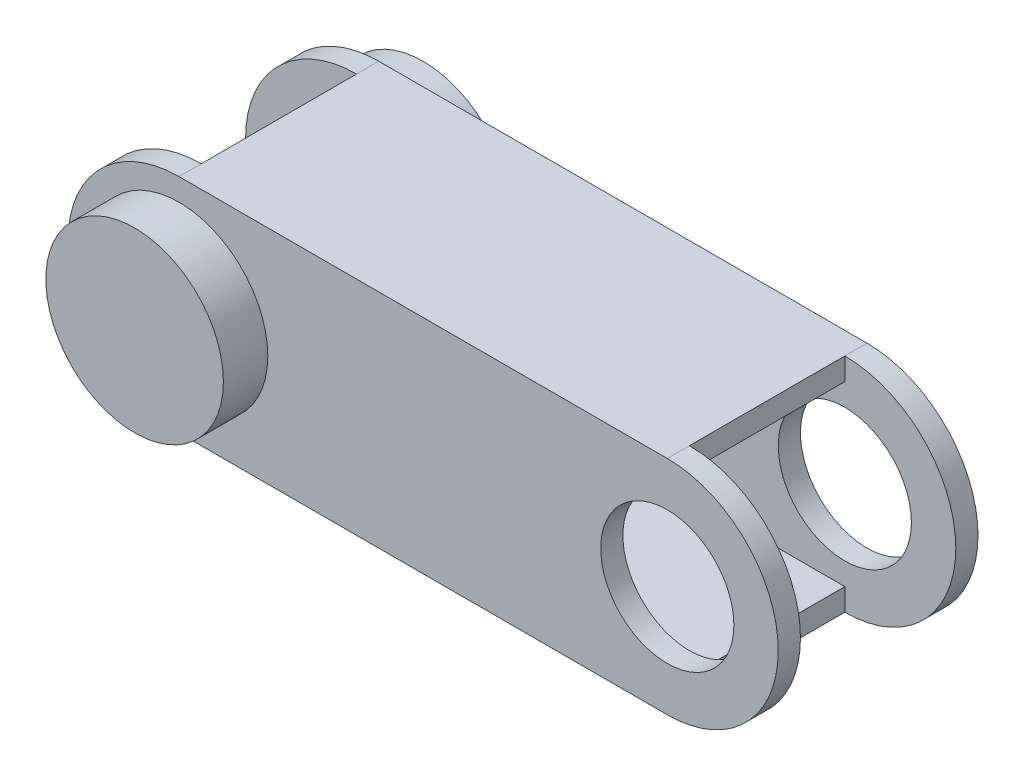
ISO-10303-21;
HEADER;
FILE_DESCRIPTION(('STEP AP214'),'2;1');
FILE_NAME('part.step','',(''),(''),'','','');
FILE_SCHEMA(('AUTOMOTIVE_DESIGN { 1 0 10303 214 1 1 1 1 }'));
ENDSEC;
DATA;
#1=APPLICATION_CONTEXT('core data for automotive mechanical design processes');
#2=APPLICATION_PROTOCOL_DEFINITION('international standard','automotive_design',2000,#1);
#3=PRODUCT_CONTEXT('',#1,'mechanical');
#4=PRODUCT('Part','Part','',(#3));
#5=PRODUCT_RELATED_PRODUCT_CATEGORY('part','',(#4));
#6=PRODUCT_DEFINITION_FORMATION('','',#4);
#7=PRODUCT_DEFINITION_CONTEXT('part definition',#1,'design');
#8=PRODUCT_DEFINITION('design','',#6,#7);
#9=PRODUCT_DEFINITION_SHAPE('','',#8);
#10=(LENGTH_UNIT() NAMED_UNIT(*) SI_UNIT(.MILLI.,.METRE.));
#11=(NAMED_UNIT(*) PLANE_ANGLE_UNIT() SI_UNIT($,.RADIAN.));
#12=(NAMED_UNIT(*) SI_UNIT($,.STERADIAN.) SOLID_ANGLE_UNIT());
#13=UNCERTAINTY_MEASURE_WITH_UNIT(LENGTH_MEASURE(1.E-05),#10,'distance_accuracy_value','');
#14=(GEOMETRIC_REPRESENTATION_CONTEXT(3) GLOBAL_UNCERTAINTY_ASSIGNED_CONTEXT((#13)) GLOBAL_UNIT_ASSIGNED_CONTEXT((#10,
#11,#12)) REPRESENTATION_CONTEXT('',''));
#15=CARTESIAN_POINT('',(0.,0.,0.));
#16=DIRECTION('',(0.,0.,1.));
#17=DIRECTION('',(1.,0.,0.));
#18=AXIS2_PLACEMENT_3D('',#15,#16,#17);
#19=CARTESIAN_POINT('',(0.,0.,0.));
#20=DIRECTION('',(0.,0.,1.));
#21=DIRECTION('',(1.,0.,0.));
#22=AXIS2_PLACEMENT_3D('',#19,#20,#21);
#23=PLANE('',#22);
#24=CARTESIAN_POINT('',(0.,0.,0.));
#25=DIRECTION('',(0.,0.,1.));
#26=DIRECTION('',(1.,0.,0.));
#27=AXIS2_PLACEMENT_3D('',#24,#25,#26);
#28=CIRCLE('',#27,30.);
#29=CARTESIAN_POINT('',(30.,0.,0.));
#30=VERTEX_POINT('',#29);
#31=EDGE_CURVE('E219',#30,#30,#28,.T.);
#32=ORIENTED_EDGE('',*,*,#31,.T.);
#33=EDGE_LOOP('',(#32));
#34=FACE_BOUND('',#33,.T.);
#35=DIRECTION('',(0.,1.,0.));
#36=VECTOR('',#35,1.);
#37=CARTESIAN_POINT('',(0.,40.,0.));
#38=LINE('',#37,#36);
#39=CARTESIAN_POINT('',(0.,40.,0.));
#40=VERTEX_POINT('',#39);
#41=CARTESIAN_POINT('',(0.,50.,0.));
#42=VERTEX_POINT('',#41);
#43=EDGE_CURVE('E150',#40,#42,#38,.T.);
#44=ORIENTED_EDGE('',*,*,#43,.T.);
#45=CARTESIAN_POINT('',(0.,0.,0.));
#46=DIRECTION('',(0.,0.,1.));
#47=DIRECTION('',(1.,0.,0.));
#48=AXIS2_PLACEMENT_3D('',#45,#46,#47);
#49=CIRCLE('',#48,50.);
#50=CARTESIAN_POINT('',(0.,-50.,0.));
#51=VERTEX_POINT('',#50);
#52=EDGE_CURVE('E225',#51,#42,#49,.T.);
#53=ORIENTED_EDGE('',*,*,#52,.F.);
#54=DIRECTION('',(0.,-1.,0.));
#55=VECTOR('',#54,1.);
#56=CARTESIAN_POINT('',(0.,-40.,0.));
#57=LINE('',#56,#55);
#58=CARTESIAN_POINT('',(0.,-40.,0.));
#59=VERTEX_POINT('',#58);
#60=EDGE_CURVE('E207',#59,#51,#57,.T.);
#61=ORIENTED_EDGE('',*,*,#60,.F.);
#62=DIRECTION('',(-1.,0.,0.));
#63=VECTOR('',#62,1.);
#64=CARTESIAN_POINT('',(0.,-40.,0.));
#65=LINE('',#64,#63);
#66=CARTESIAN_POINT('',(-220.,-40.,0.));
#67=VERTEX_POINT('',#66);
#68=EDGE_CURVE('E200',#59,#67,#65,.T.);
#69=ORIENTED_EDGE('',*,*,#68,.T.);
#70=DIRECTION('',(0.,-1.,0.));
#71=VECTOR('',#70,1.);
#72=CARTESIAN_POINT('',(-220.,-40.,0.));
#73=LINE('',#72,#71);
#74=CARTESIAN_POINT('',(-220.,-50.,0.));
#75=VERTEX_POINT('',#74);
#76=EDGE_CURVE('E217',#67,#75,#73,.T.);
#77=ORIENTED_EDGE('',*,*,#76,.T.);
#78=CARTESIAN_POINT('',(-220.,0.,0.));
#79=DIRECTION('',(0.,0.,1.));
#80=DIRECTION('',(1.,0.,0.));
#81=AXIS2_PLACEMENT_3D('',#78,#79,#80);
#82=CIRCLE('',#81,50.);
#83=CARTESIAN_POINT('',(-220.,50.,0.));
#84=VERTEX_POINT('',#83);
#85=EDGE_CURVE('E149',#84,#75,#82,.T.);
#86=ORIENTED_EDGE('',*,*,#85,.F.);
#87=DIRECTION('',(0.,1.,0.));
#88=VECTOR('',#87,1.);
#89=CARTESIAN_POINT('',(-220.,40.,0.));
#90=LINE('',#89,#88);
#91=CARTESIAN_POINT('',(-220.,40.,0.));
#92=VERTEX_POINT('',#91);
#93=EDGE_CURVE('E138',#92,#84,#90,.T.);
#94=ORIENTED_EDGE('',*,*,#93,.F.);
#95=DIRECTION('',(-1.,0.,0.));
#96=VECTOR('',#95,1.);
#97=CARTESIAN_POINT('',(0.,40.,0.));
#98=LINE('',#97,#96);
#99=EDGE_CURVE('E128',#40,#92,#98,.T.);
#100=ORIENTED_EDGE('',*,*,#99,.F.);
#101=EDGE_LOOP('',(#44,#53,#61,#69,#77,#86,#94,#100));
#102=FACE_BOUND('',#101,.T.);
#103=ADVANCED_FACE('F41',(#34,#102),#23,.F.);
#104=CARTESIAN_POINT('',(0.,0.,-70.));
#105=DIRECTION('',(0.,0.,-1.));
#106=DIRECTION('',(1.,0.,0.));
#107=AXIS2_PLACEMENT_3D('',#104,#105,#106);
#108=PLANE('',#107);
#109=CARTESIAN_POINT('',(0.,0.,-70.));
#110=DIRECTION('',(0.,0.,1.));
#111=DIRECTION('',(1.,0.,0.));
#112=AXIS2_PLACEMENT_3D('',#109,#110,#111);
#113=CIRCLE('',#112,30.);
#114=CARTESIAN_POINT('',(30.,0.,-70.));
#115=VERTEX_POINT('',#114);
#116=EDGE_CURVE('E158',#115,#115,#113,.T.);
#117=ORIENTED_EDGE('',*,*,#116,.F.);
#118=EDGE_LOOP('',(#117));
#119=FACE_BOUND('',#118,.T.);
#120=DIRECTION('',(0.,1.,0.));
#121=VECTOR('',#120,1.);
#122=CARTESIAN_POINT('',(0.,0.,-70.));
#123=LINE('',#122,#121);
#124=CARTESIAN_POINT('',(0.,40.,-70.));
#125=VERTEX_POINT('',#124);
#126=CARTESIAN_POINT('',(0.,50.,-70.));
#127=VERTEX_POINT('',#126);
#128=EDGE_CURVE('E11',#125,#127,#123,.T.);
#129=ORIENTED_EDGE('',*,*,#128,.F.);
#130=DIRECTION('',(-1.,0.,0.));
#131=VECTOR('',#130,1.);
#132=CARTESIAN_POINT('',(0.,40.,-70.));
#133=LINE('',#132,#131);
#134=CARTESIAN_POINT('',(-220.,40.,-70.));
#135=VERTEX_POINT('',#134);
#136=EDGE_CURVE('E56',#125,#135,#133,.T.);
#137=ORIENTED_EDGE('',*,*,#136,.T.);
#138=DIRECTION('',(0.,-1.,0.));
#139=VECTOR('',#138,1.);
#140=CARTESIAN_POINT('',(-220.,0.,-70.));
#141=LINE('',#140,#139);
#142=CARTESIAN_POINT('',(-220.,50.,-70.));
#143=VERTEX_POINT('',#142);
#144=EDGE_CURVE('E49',#143,#135,#141,.T.);
#145=ORIENTED_EDGE('',*,*,#144,.F.);
#146=CARTESIAN_POINT('',(-220.,0.,-70.));
#147=DIRECTION('',(0.,0.,1.));
#148=DIRECTION('',(1.,0.,0.));
#149=AXIS2_PLACEMENT_3D('',#146,#147,#148);
#150=CIRCLE('',#149,50.);
#151=CARTESIAN_POINT('',(-220.,-50.,-70.));
#152=VERTEX_POINT('',#151);
#153=EDGE_CURVE('E173',#143,#152,#150,.T.);
#154=ORIENTED_EDGE('',*,*,#153,.T.);
#155=DIRECTION('',(0.,-1.,0.));
#156=VECTOR('',#155,1.);
#157=CARTESIAN_POINT('',(-220.,-40.,-70.));
#158=LINE('',#157,#156);
#159=CARTESIAN_POINT('',(-220.,-40.,-70.));
#160=VERTEX_POINT('',#159);
#161=EDGE_CURVE('E188',#160,#152,#158,.T.);
#162=ORIENTED_EDGE('',*,*,#161,.F.);
#163=DIRECTION('',(-1.,0.,0.));
#164=VECTOR('',#163,1.);
#165=CARTESIAN_POINT('',(0.,-40.,-70.));
#166=LINE('',#165,#164);
#167=CARTESIAN_POINT('',(0.,-40.,-70.));
#168=VERTEX_POINT('',#167);
#169=EDGE_CURVE('E162',#168,#160,#166,.T.);
#170=ORIENTED_EDGE('',*,*,#169,.F.);
#171=DIRECTION('',(0.,1.,0.));
#172=VECTOR('',#171,1.);
#173=CARTESIAN_POINT('',(0.,-40.,-70.));
#174=LINE('',#173,#172);
#175=CARTESIAN_POINT('',(0.,-50.,-70.));
#176=VERTEX_POINT('',#175);
#177=EDGE_CURVE('E191',#176,#168,#174,.T.);
#178=ORIENTED_EDGE('',*,*,#177,.F.);
#179=CARTESIAN_POINT('',(0.,0.,-70.));
#180=DIRECTION('',(0.,0.,1.));
#181=DIRECTION('',(1.,0.,0.));
#182=AXIS2_PLACEMENT_3D('',#179,#180,#181);
#183=CIRCLE('',#182,50.);
#184=EDGE_CURVE('E166',#176,#127,#183,.T.);
#185=ORIENTED_EDGE('',*,*,#184,.T.);
#186=EDGE_LOOP('',(#129,#137,#145,#154,#162,#170,#178,#185));
#187=FACE_BOUND('',#186,.T.);
#188=ADVANCED_FACE('F297',(#119,#187),#108,.F.);
#189=CARTESIAN_POINT('',(0.,-40.,0.));
#190=DIRECTION('',(1.,0.,0.));
#191=DIRECTION('',(0.,1.,0.));
#192=AXIS2_PLACEMENT_3D('',#189,#190,#191);
#193=PLANE('',#192);
#194=DIRECTION('',(0.,0.,1.));
#195=VECTOR('',#194,1.);
#196=CARTESIAN_POINT('',(0.,-50.,0.));
#197=LINE('',#196,#195);
#198=EDGE_CURVE('E212',#176,#51,#197,.T.);
#199=ORIENTED_EDGE('',*,*,#198,.F.);
#200=ORIENTED_EDGE('',*,*,#177,.T.);
#201=DIRECTION('',(0.,0.,1.));
#202=VECTOR('',#201,1.);
#203=CARTESIAN_POINT('',(0.,-40.,0.));
#204=LINE('',#203,#202);
#205=EDGE_CURVE('E198',#168,#59,#204,.T.);
#206=ORIENTED_EDGE('',*,*,#205,.T.);
#207=ORIENTED_EDGE('',*,*,#60,.T.);
#208=EDGE_LOOP('',(#199,#200,#206,#207));
#209=FACE_BOUND('',#208,.T.);
#210=ADVANCED_FACE('F303',(#209),#193,.T.);
#211=CARTESIAN_POINT('',(-220.,-40.,0.));
#212=DIRECTION('',(-1.,0.,0.));
#213=DIRECTION('',(0.,-1.,0.));
#214=AXIS2_PLACEMENT_3D('',#211,#212,#213);
#215=PLANE('',#214);
#216=DIRECTION('',(0.,0.,-1.));
#217=VECTOR('',#216,1.);
#218=CARTESIAN_POINT('',(-220.,-40.,0.));
#219=LINE('',#218,#217);
#220=EDGE_CURVE('E204',#67,#160,#219,.T.);
#221=ORIENTED_EDGE('',*,*,#220,.T.);
#222=ORIENTED_EDGE('',*,*,#161,.T.);
#223=DIRECTION('',(0.,0.,-1.));
#224=VECTOR('',#223,1.);
#225=CARTESIAN_POINT('',(-220.,-50.,0.));
#226=LINE('',#225,#224);
#227=EDGE_CURVE('E211',#75,#152,#226,.T.);
#228=ORIENTED_EDGE('',*,*,#227,.F.);
#229=ORIENTED_EDGE('',*,*,#76,.F.);
#230=EDGE_LOOP('',(#221,#222,#228,#229));
#231=FACE_BOUND('',#230,.T.);
#232=ADVANCED_FACE('F261',(#231),#215,.T.);
#233=CARTESIAN_POINT('',(0.,-40.,0.));
#234=DIRECTION('',(0.,1.,0.));
#235=DIRECTION('',(-1.,0.,0.));
#236=AXIS2_PLACEMENT_3D('',#233,#234,#235);
#237=PLANE('',#236);
#238=ORIENTED_EDGE('',*,*,#205,.F.);
#239=ORIENTED_EDGE('',*,*,#169,.T.);
#240=ORIENTED_EDGE('',*,*,#220,.F.);
#241=ORIENTED_EDGE('',*,*,#68,.F.);
#242=EDGE_LOOP('',(#238,#239,#240,#241));
#243=FACE_BOUND('',#242,.T.);
#244=ADVANCED_FACE('F258',(#243),#237,.T.);
#245=CARTESIAN_POINT('',(0.,0.,10.));
#246=DIRECTION('',(0.,0.,1.));
#247=DIRECTION('',(1.,0.,0.));
#248=AXIS2_PLACEMENT_3D('',#245,#246,#247);
#249=PLANE('',#248);
#250=DIRECTION('',(1.,0.,0.));
#251=VECTOR('',#250,1.);
#252=CARTESIAN_POINT('',(0.,-50.,10.));
#253=LINE('',#252,#251);
#254=CARTESIAN_POINT('',(-220.,-50.,10.));
#255=VERTEX_POINT('',#254);
#256=CARTESIAN_POINT('',(0.,-50.,10.));
#257=VERTEX_POINT('',#256);
#258=EDGE_CURVE('E235',#255,#257,#253,.T.);
#259=ORIENTED_EDGE('',*,*,#258,.T.);
#260=CARTESIAN_POINT('',(0.,0.,10.));
#261=DIRECTION('',(0.,0.,1.));
#262=DIRECTION('',(1.,0.,0.));
#263=AXIS2_PLACEMENT_3D('',#260,#261,#262);
#264=CIRCLE('',#263,50.);
#265=CARTESIAN_POINT('',(0.,50.,10.));
#266=VERTEX_POINT('',#265);
#267=EDGE_CURVE('E228',#257,#266,#264,.T.);
#268=ORIENTED_EDGE('',*,*,#267,.T.);
#269=DIRECTION('',(-1.,0.,0.));
#270=VECTOR('',#269,1.);
#271=CARTESIAN_POINT('',(0.,50.,10.));
#272=LINE('',#271,#270);
#273=CARTESIAN_POINT('',(-220.,50.,10.));
#274=VERTEX_POINT('',#273);
#275=EDGE_CURVE('E231',#266,#274,#272,.T.);
#276=ORIENTED_EDGE('',*,*,#275,.T.);
#277=CARTESIAN_POINT('',(-220.,0.,10.));
#278=DIRECTION('',(0.,0.,1.));
#279=DIRECTION('',(1.,0.,0.));
#280=AXIS2_PLACEMENT_3D('',#277,#278,#279);
#281=CIRCLE('',#280,50.);
#282=EDGE_CURVE('E233',#274,#255,#281,.T.);
#283=ORIENTED_EDGE('',*,*,#282,.T.);
#284=EDGE_LOOP('',(#259,#268,#276,#283));
#285=FACE_BOUND('',#284,.T.);
#286=CARTESIAN_POINT('',(-220.,0.,10.));
#287=DIRECTION('',(0.,0.,1.));
#288=DIRECTION('',(1.,0.,0.));
#289=AXIS2_PLACEMENT_3D('',#286,#287,#288);
#290=CIRCLE('',#289,40.);
#291=CARTESIAN_POINT('',(-180.,0.,10.));
#292=VERTEX_POINT('',#291);
#293=EDGE_CURVE('E197',#292,#292,#290,.F.);
#294=ORIENTED_EDGE('',*,*,#293,.T.);
#295=EDGE_LOOP('',(#294));
#296=FACE_BOUND('',#295,.T.);
#297=CARTESIAN_POINT('',(0.,0.,10.));
#298=DIRECTION('',(0.,0.,1.));
#299=DIRECTION('',(1.,0.,0.));
#300=AXIS2_PLACEMENT_3D('',#297,#298,#299);
#301=CIRCLE('',#300,30.);
#302=CARTESIAN_POINT('',(30.,0.,10.));
#303=VERTEX_POINT('',#302);
#304=EDGE_CURVE('E222',#303,#303,#301,.T.);
#305=ORIENTED_EDGE('',*,*,#304,.F.);
#306=EDGE_LOOP('',(#305));
#307=FACE_BOUND('',#306,.T.);
#308=ADVANCED_FACE('F275',(#285,#296,#307),#249,.T.);
#309=CARTESIAN_POINT('',(0.,0.,10.));
#310=DIRECTION('',(0.,0.,-1.));
#311=DIRECTION('',(-1.,0.,0.));
#312=AXIS2_PLACEMENT_3D('',#309,#310,#311);
#313=CYLINDRICAL_SURFACE('',#312,50.);
#314=ORIENTED_EDGE('',*,*,#52,.T.);
#315=DIRECTION('',(0.,0.,-1.));
#316=VECTOR('',#315,1.);
#317=CARTESIAN_POINT('',(0.,50.,10.));
#318=LINE('',#317,#316);
#319=EDGE_CURVE('E248',#266,#42,#318,.T.);
#320=ORIENTED_EDGE('',*,*,#319,.F.);
#321=ORIENTED_EDGE('',*,*,#267,.F.);
#322=DIRECTION('',(0.,0.,-1.));
#323=VECTOR('',#322,1.);
#324=CARTESIAN_POINT('',(0.,-50.,10.));
#325=LINE('',#324,#323);
#326=EDGE_CURVE('E237',#257,#51,#325,.T.);
#327=ORIENTED_EDGE('',*,*,#326,.T.);
#328=EDGE_LOOP('',(#314,#320,#321,#327));
#329=FACE_BOUND('',#328,.T.);
#330=ADVANCED_FACE('F43',(#329),#313,.T.);
#331=CARTESIAN_POINT('',(0.,50.,10.));
#332=DIRECTION('',(0.,-1.,0.));
#333=DIRECTION('',(1.,0.,0.));
#334=AXIS2_PLACEMENT_3D('',#331,#332,#333);
#335=PLANE('',#334);
#336=ORIENTED_EDGE('',*,*,#319,.T.);
#337=DIRECTION('',(0.,0.,1.));
#338=VECTOR('',#337,1.);
#339=CARTESIAN_POINT('',(0.,50.,0.));
#340=LINE('',#339,#338);
#341=EDGE_CURVE('E281',#127,#42,#340,.T.);
#342=ORIENTED_EDGE('',*,*,#341,.F.);
#343=DIRECTION('',(0.,0.,1.));
#344=VECTOR('',#343,1.);
#345=CARTESIAN_POINT('',(0.,50.,-80.));
#346=LINE('',#345,#344);
#347=CARTESIAN_POINT('',(0.,50.,-80.));
#348=VERTEX_POINT('',#347);
#349=EDGE_CURVE('E178',#348,#127,#346,.T.);
#350=ORIENTED_EDGE('',*,*,#349,.F.);
#351=DIRECTION('',(-1.,0.,0.));
#352=VECTOR('',#351,1.);
#353=CARTESIAN_POINT('',(0.,50.,-80.));
#354=LINE('',#353,#352);
#355=CARTESIAN_POINT('',(-220.,50.,-80.));
#356=VERTEX_POINT('',#355);
#357=EDGE_CURVE('E175',#348,#356,#354,.T.);
#358=ORIENTED_EDGE('',*,*,#357,.T.);
#359=DIRECTION('',(0.,0.,1.));
#360=VECTOR('',#359,1.);
#361=CARTESIAN_POINT('',(-220.,50.,-80.));
#362=LINE('',#361,#360);
#363=EDGE_CURVE('E183',#356,#143,#362,.T.);
#364=ORIENTED_EDGE('',*,*,#363,.T.);
#365=DIRECTION('',(0.,0.,-1.));
#366=VECTOR('',#365,1.);
#367=CARTESIAN_POINT('',(-220.,50.,0.));
#368=LINE('',#367,#366);
#369=EDGE_CURVE('E280',#84,#143,#368,.T.);
#370=ORIENTED_EDGE('',*,*,#369,.F.);
#371=DIRECTION('',(0.,0.,-1.));
#372=VECTOR('',#371,1.);
#373=CARTESIAN_POINT('',(-220.,50.,10.));
#374=LINE('',#373,#372);
#375=EDGE_CURVE('E246',#274,#84,#374,.T.);
#376=ORIENTED_EDGE('',*,*,#375,.F.);
#377=ORIENTED_EDGE('',*,*,#275,.F.);
#378=EDGE_LOOP('',(#336,#342,#350,#358,#364,#370,#376,#377));
#379=FACE_BOUND('',#378,.T.);
#380=ADVANCED_FACE('F279',(#379),#335,.F.);
#381=CARTESIAN_POINT('',(-220.,0.,10.));
#382=DIRECTION('',(0.,0.,-1.));
#383=DIRECTION('',(-1.,0.,0.));
#384=AXIS2_PLACEMENT_3D('',#381,#382,#383);
#385=CYLINDRICAL_SURFACE('',#384,50.);
#386=ORIENTED_EDGE('',*,*,#85,.T.);
#387=DIRECTION('',(0.,0.,-1.));
#388=VECTOR('',#387,1.);
#389=CARTESIAN_POINT('',(-220.,-50.,10.));
#390=LINE('',#389,#388);
#391=EDGE_CURVE('E243',#255,#75,#390,.T.);
#392=ORIENTED_EDGE('',*,*,#391,.F.);
#393=ORIENTED_EDGE('',*,*,#282,.F.);
#394=ORIENTED_EDGE('',*,*,#375,.T.);
#395=EDGE_LOOP('',(#386,#392,#393,#394));
#396=FACE_BOUND('',#395,.T.);
#397=ADVANCED_FACE('F265',(#396),#385,.T.);
#398=CARTESIAN_POINT('',(0.,-50.,10.));
#399=DIRECTION('',(0.,1.,0.));
#400=DIRECTION('',(-1.,0.,0.));
#401=AXIS2_PLACEMENT_3D('',#398,#399,#400);
#402=PLANE('',#401);
#403=ORIENTED_EDGE('',*,*,#227,.T.);
#404=DIRECTION('',(0.,0.,1.));
#405=VECTOR('',#404,1.);
#406=CARTESIAN_POINT('',(-220.,-50.,-80.));
#407=LINE('',#406,#405);
#408=CARTESIAN_POINT('',(-220.,-50.,-80.));
#409=VERTEX_POINT('',#408);
#410=EDGE_CURVE('E186',#409,#152,#407,.T.);
#411=ORIENTED_EDGE('',*,*,#410,.F.);
#412=DIRECTION('',(1.,0.,0.));
#413=VECTOR('',#412,1.);
#414=CARTESIAN_POINT('',(0.,-50.,-80.));
#415=LINE('',#414,#413);
#416=CARTESIAN_POINT('',(0.,-50.,-80.));
#417=VERTEX_POINT('',#416);
#418=EDGE_CURVE('E201',#409,#417,#415,.T.);
#419=ORIENTED_EDGE('',*,*,#418,.T.);
#420=EDGE_CURVE('E208',#417,#176,#197,.T.);
#421=ORIENTED_EDGE('',*,*,#420,.T.);
#422=ORIENTED_EDGE('',*,*,#198,.T.);
#423=ORIENTED_EDGE('',*,*,#326,.F.);
#424=ORIENTED_EDGE('',*,*,#258,.F.);
#425=ORIENTED_EDGE('',*,*,#391,.T.);
#426=EDGE_LOOP('',(#403,#411,#419,#421,#422,#423,#424,#425));
#427=FACE_BOUND('',#426,.T.);
#428=ADVANCED_FACE('F270',(#427),#402,.F.);
#429=CARTESIAN_POINT('',(0.,0.,10.));
#430=DIRECTION('',(0.,0.,-1.));
#431=DIRECTION('',(-1.,0.,0.));
#432=AXIS2_PLACEMENT_3D('',#429,#430,#431);
#433=CYLINDRICAL_SURFACE('',#432,30.);
#434=ORIENTED_EDGE('',*,*,#304,.T.);
#435=EDGE_LOOP('',(#434));
#436=FACE_BOUND('',#435,.T.);
#437=ORIENTED_EDGE('',*,*,#31,.F.);
#438=EDGE_LOOP('',(#437));
#439=FACE_BOUND('',#438,.T.);
#440=ADVANCED_FACE('F310',(#436,#439),#433,.F.);
#441=CARTESIAN_POINT('',(0.,-40.,-80.));
#442=DIRECTION('',(0.,0.,-1.));
#443=DIRECTION('',(-1.,0.,0.));
#444=AXIS2_PLACEMENT_3D('',#441,#442,#443);
#445=PLANE('',#444);
#446=ORIENTED_EDGE('',*,*,#357,.F.);
#447=CARTESIAN_POINT('',(0.,0.,-80.));
#448=DIRECTION('',(0.,0.,1.));
#449=DIRECTION('',(1.,0.,0.));
#450=AXIS2_PLACEMENT_3D('',#447,#448,#449);
#451=CIRCLE('',#450,50.);
#452=EDGE_CURVE('E169',#417,#348,#451,.T.);
#453=ORIENTED_EDGE('',*,*,#452,.F.);
#454=ORIENTED_EDGE('',*,*,#418,.F.);
#455=CARTESIAN_POINT('',(-220.,0.,-80.));
#456=DIRECTION('',(0.,0.,1.));
#457=DIRECTION('',(1.,0.,0.));
#458=AXIS2_PLACEMENT_3D('',#455,#456,#457);
#459=CIRCLE('',#458,50.);
#460=EDGE_CURVE('E172',#356,#409,#459,.T.);
#461=ORIENTED_EDGE('',*,*,#460,.F.);
#462=EDGE_LOOP('',(#446,#453,#454,#461));
#463=FACE_BOUND('',#462,.T.);
#464=CARTESIAN_POINT('',(-220.,0.,-80.));
#465=DIRECTION('',(0.,0.,-1.));
#466=DIRECTION('',(-1.,0.,0.));
#467=AXIS2_PLACEMENT_3D('',#464,#465,#466);
#468=CIRCLE('',#467,40.);
#469=CARTESIAN_POINT('',(-260.,0.,-80.));
#470=VERTEX_POINT('',#469);
#471=EDGE_CURVE('E159',#470,#470,#468,.T.);
#472=ORIENTED_EDGE('',*,*,#471,.F.);
#473=EDGE_LOOP('',(#472));
#474=FACE_BOUND('',#473,.T.);
#475=CARTESIAN_POINT('',(0.,0.,-80.));
#476=DIRECTION('',(0.,0.,1.));
#477=DIRECTION('',(1.,0.,0.));
#478=AXIS2_PLACEMENT_3D('',#475,#476,#477);
#479=CIRCLE('',#478,30.);
#480=CARTESIAN_POINT('',(30.,0.,-80.));
#481=VERTEX_POINT('',#480);
#482=EDGE_CURVE('E163',#481,#481,#479,.T.);
#483=ORIENTED_EDGE('',*,*,#482,.T.);
#484=EDGE_LOOP('',(#483));
#485=FACE_BOUND('',#484,.T.);
#486=ADVANCED_FACE('F322',(#463,#474,#485),#445,.T.);
#487=CARTESIAN_POINT('',(-220.,0.,30.));
#488=DIRECTION('',(0.,0.,-1.));
#489=DIRECTION('',(-1.,0.,0.));
#490=AXIS2_PLACEMENT_3D('',#487,#488,#489);
#491=CYLINDRICAL_SURFACE('',#490,40.);
#492=ORIENTED_EDGE('',*,*,#293,.F.);
#493=EDGE_LOOP('',(#492));
#494=FACE_BOUND('',#493,.T.);
#495=CARTESIAN_POINT('',(-220.,0.,30.));
#496=DIRECTION('',(0.,0.,1.));
#497=DIRECTION('',(1.,0.,0.));
#498=AXIS2_PLACEMENT_3D('',#495,#496,#497);
#499=CIRCLE('',#498,40.);
#500=CARTESIAN_POINT('',(-180.,0.,30.));
#501=VERTEX_POINT('',#500);
#502=EDGE_CURVE('E194',#501,#501,#499,.T.);
#503=ORIENTED_EDGE('',*,*,#502,.F.);
#504=EDGE_LOOP('',(#503));
#505=FACE_BOUND('',#504,.T.);
#506=ADVANCED_FACE('F326',(#494,#505),#491,.T.);
#507=CARTESIAN_POINT('',(-220.,0.,30.));
#508=DIRECTION('',(0.,0.,1.));
#509=DIRECTION('',(1.,0.,0.));
#510=AXIS2_PLACEMENT_3D('',#507,#508,#509);
#511=PLANE('',#510);
#512=ORIENTED_EDGE('',*,*,#502,.T.);
#513=EDGE_LOOP('',(#512));
#514=FACE_BOUND('',#513,.T.);
#515=ADVANCED_FACE('F338',(#514),#511,.T.);
#516=CARTESIAN_POINT('',(0.,0.,-80.));
#517=DIRECTION('',(0.,0.,1.));
#518=DIRECTION('',(1.,0.,0.));
#519=AXIS2_PLACEMENT_3D('',#516,#517,#518);
#520=CYLINDRICAL_SURFACE('',#519,50.);
#521=ORIENTED_EDGE('',*,*,#184,.F.);
#522=ORIENTED_EDGE('',*,*,#420,.F.);
#523=ORIENTED_EDGE('',*,*,#452,.T.);
#524=ORIENTED_EDGE('',*,*,#349,.T.);
#525=EDGE_LOOP('',(#521,#522,#523,#524));
#526=FACE_BOUND('',#525,.T.);
#527=ADVANCED_FACE('F334',(#526),#520,.T.);
#528=CARTESIAN_POINT('',(-220.,0.,-80.));
#529=DIRECTION('',(0.,0.,1.));
#530=DIRECTION('',(1.,0.,0.));
#531=AXIS2_PLACEMENT_3D('',#528,#529,#530);
#532=CYLINDRICAL_SURFACE('',#531,50.);
#533=ORIENTED_EDGE('',*,*,#153,.F.);
#534=ORIENTED_EDGE('',*,*,#363,.F.);
#535=ORIENTED_EDGE('',*,*,#460,.T.);
#536=ORIENTED_EDGE('',*,*,#410,.T.);
#537=EDGE_LOOP('',(#533,#534,#535,#536));
#538=FACE_BOUND('',#537,.T.);
#539=ADVANCED_FACE('F337',(#538),#532,.T.);
#540=CARTESIAN_POINT('',(0.,0.,-80.));
#541=DIRECTION('',(0.,0.,1.));
#542=DIRECTION('',(1.,0.,0.));
#543=AXIS2_PLACEMENT_3D('',#540,#541,#542);
#544=CYLINDRICAL_SURFACE('',#543,30.);
#545=ORIENTED_EDGE('',*,*,#482,.F.);
#546=EDGE_LOOP('',(#545));
#547=FACE_BOUND('',#546,.T.);
#548=ORIENTED_EDGE('',*,*,#116,.T.);
#549=EDGE_LOOP('',(#548));
#550=FACE_BOUND('',#549,.T.);
#551=ADVANCED_FACE('F350',(#547,#550),#544,.F.);
#552=CARTESIAN_POINT('',(-220.,0.,-100.));
#553=DIRECTION('',(0.,0.,1.));
#554=DIRECTION('',(1.,0.,0.));
#555=AXIS2_PLACEMENT_3D('',#552,#553,#554);
#556=CYLINDRICAL_SURFACE('',#555,40.);
#557=ORIENTED_EDGE('',*,*,#471,.T.);
#558=EDGE_LOOP('',(#557));
#559=FACE_BOUND('',#558,.T.);
#560=CARTESIAN_POINT('',(-220.,0.,-100.));
#561=DIRECTION('',(0.,0.,1.));
#562=DIRECTION('',(1.,0.,0.));
#563=AXIS2_PLACEMENT_3D('',#560,#561,#562);
#564=CIRCLE('',#563,40.);
#565=CARTESIAN_POINT('',(-180.,0.,-100.));
#566=VERTEX_POINT('',#565);
#567=EDGE_CURVE('E152',#566,#566,#564,.T.);
#568=ORIENTED_EDGE('',*,*,#567,.T.);
#569=EDGE_LOOP('',(#568));
#570=FACE_BOUND('',#569,.T.);
#571=ADVANCED_FACE('F345',(#559,#570),#556,.T.);
#572=CARTESIAN_POINT('',(-220.,0.,-100.));
#573=DIRECTION('',(0.,0.,-1.));
#574=DIRECTION('',(1.,0.,0.));
#575=AXIS2_PLACEMENT_3D('',#572,#573,#574);
#576=PLANE('',#575);
#577=ORIENTED_EDGE('',*,*,#567,.F.);
#578=EDGE_LOOP('',(#577));
#579=FACE_BOUND('',#578,.T.);
#580=ADVANCED_FACE('F349',(#579),#576,.T.);
#581=CARTESIAN_POINT('',(0.,40.,0.));
#582=DIRECTION('',(-1.,0.,0.));
#583=DIRECTION('',(0.,-1.,0.));
#584=AXIS2_PLACEMENT_3D('',#581,#582,#583);
#585=PLANE('',#584);
#586=DIRECTION('',(0.,0.,1.));
#587=VECTOR('',#586,1.);
#588=CARTESIAN_POINT('',(0.,40.,0.));
#589=LINE('',#588,#587);
#590=EDGE_CURVE('E133',#125,#40,#589,.T.);
#591=ORIENTED_EDGE('',*,*,#590,.F.);
#592=ORIENTED_EDGE('',*,*,#128,.T.);
#593=ORIENTED_EDGE('',*,*,#341,.T.);
#594=ORIENTED_EDGE('',*,*,#43,.F.);
#595=EDGE_LOOP('',(#591,#592,#593,#594));
#596=FACE_BOUND('',#595,.T.);
#597=ADVANCED_FACE('F286',(#596),#585,.F.);
#598=CARTESIAN_POINT('',(-220.,40.,0.));
#599=DIRECTION('',(1.,0.,0.));
#600=DIRECTION('',(0.,1.,0.));
#601=AXIS2_PLACEMENT_3D('',#598,#599,#600);
#602=PLANE('',#601);
#603=ORIENTED_EDGE('',*,*,#369,.T.);
#604=ORIENTED_EDGE('',*,*,#144,.T.);
#605=DIRECTION('',(0.,0.,-1.));
#606=VECTOR('',#605,1.);
#607=CARTESIAN_POINT('',(-220.,40.,0.));
#608=LINE('',#607,#606);
#609=EDGE_CURVE('E131',#92,#135,#608,.T.);
#610=ORIENTED_EDGE('',*,*,#609,.F.);
#611=ORIENTED_EDGE('',*,*,#93,.T.);
#612=EDGE_LOOP('',(#603,#604,#610,#611));
#613=FACE_BOUND('',#612,.T.);
#614=ADVANCED_FACE('F143',(#613),#602,.F.);
#615=CARTESIAN_POINT('',(0.,40.,0.));
#616=DIRECTION('',(0.,-1.,0.));
#617=DIRECTION('',(-1.,0.,0.));
#618=AXIS2_PLACEMENT_3D('',#615,#616,#617);
#619=PLANE('',#618);
#620=ORIENTED_EDGE('',*,*,#136,.F.);
#621=ORIENTED_EDGE('',*,*,#590,.T.);
#622=ORIENTED_EDGE('',*,*,#99,.T.);
#623=ORIENTED_EDGE('',*,*,#609,.T.);
#624=EDGE_LOOP('',(#620,#621,#622,#623));
#625=FACE_BOUND('',#624,.T.);
#626=ADVANCED_FACE('F130',(#625),#619,.T.);
#627=CLOSED_SHELL('',(#103,#188,#210,#232,#244,#308,#330,#380,#397,#428,#440,#486,#506,#515,
#527,#539,#551,#571,#580,#597,#614,#626));
#628=MANIFOLD_SOLID_BREP('B2',#627);
#629=ADVANCED_BREP_SHAPE_REPRESENTATION('',(#18,#628),#14);
#630=SHAPE_DEFINITION_REPRESENTATION(#9,#629);
ENDSEC;
END-ISO-10303-21;
